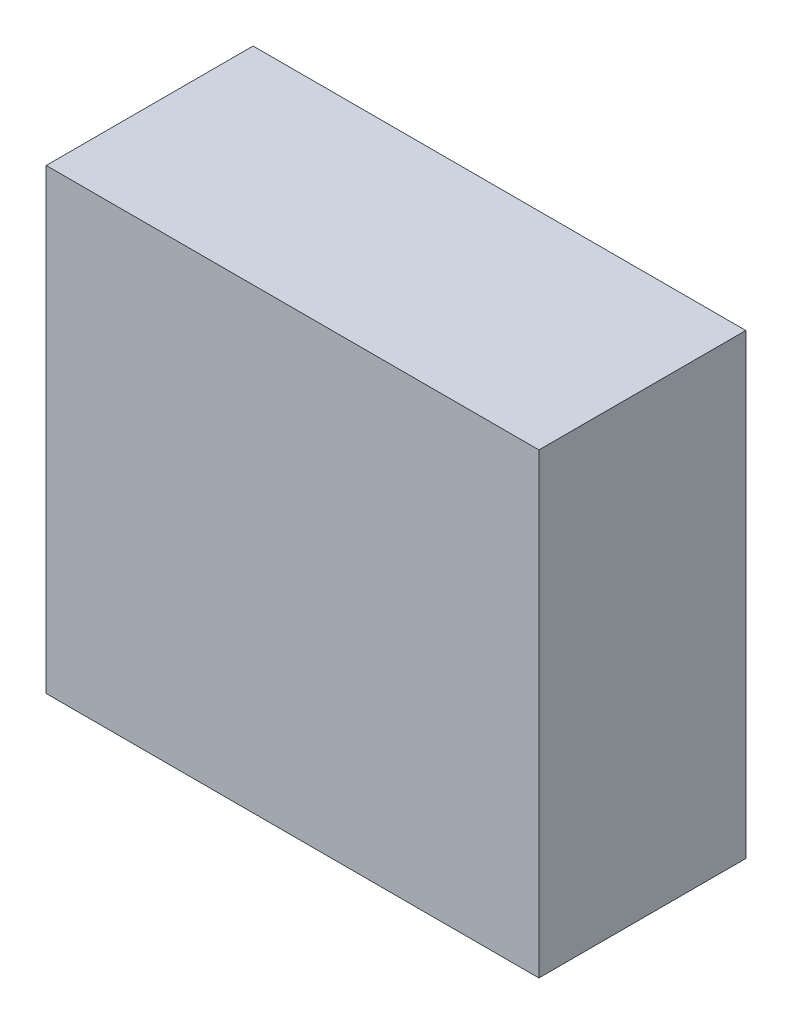
ISO-10303-21;
HEADER;
FILE_DESCRIPTION(('STEP AP214'),'2;1');
FILE_NAME('part.step','',(''),(''),'','','');
FILE_SCHEMA(('AUTOMOTIVE_DESIGN { 1 0 10303 214 1 1 1 1 }'));
ENDSEC;
DATA;
#1=APPLICATION_CONTEXT('core data for automotive mechanical design processes');
#2=APPLICATION_PROTOCOL_DEFINITION('international standard','automotive_design',2000,#1);
#3=PRODUCT_CONTEXT('',#1,'mechanical');
#4=PRODUCT('Part','Part','',(#3));
#5=PRODUCT_RELATED_PRODUCT_CATEGORY('part','',(#4));
#6=PRODUCT_DEFINITION_FORMATION('','',#4);
#7=PRODUCT_DEFINITION_CONTEXT('part definition',#1,'design');
#8=PRODUCT_DEFINITION('design','',#6,#7);
#9=PRODUCT_DEFINITION_SHAPE('','',#8);
#10=(LENGTH_UNIT() NAMED_UNIT(*) SI_UNIT(.MILLI.,.METRE.));
#11=(NAMED_UNIT(*) PLANE_ANGLE_UNIT() SI_UNIT($,.RADIAN.));
#12=(NAMED_UNIT(*) SI_UNIT($,.STERADIAN.) SOLID_ANGLE_UNIT());
#13=UNCERTAINTY_MEASURE_WITH_UNIT(LENGTH_MEASURE(1.E-05),#10,'distance_accuracy_value','');
#14=(GEOMETRIC_REPRESENTATION_CONTEXT(3) GLOBAL_UNCERTAINTY_ASSIGNED_CONTEXT((#13)) GLOBAL_UNIT_ASSIGNED_CONTEXT((#10,
#11,#12)) REPRESENTATION_CONTEXT('',''));
#15=CARTESIAN_POINT('',(0.,0.,0.));
#16=DIRECTION('',(0.,0.,1.));
#17=DIRECTION('',(1.,0.,0.));
#18=AXIS2_PLACEMENT_3D('',#15,#16,#17);
#19=CARTESIAN_POINT('',(-90.5,168.,38.));
#20=DIRECTION('',(1.,0.,0.));
#21=DIRECTION('',(0.,0.,-1.));
#22=AXIS2_PLACEMENT_3D('',#19,#20,#21);
#23=PLANE('',#22);
#24=DIRECTION('',(0.,0.,1.));
#25=VECTOR('',#24,1.);
#26=CARTESIAN_POINT('',(-90.5,0.,38.));
#27=LINE('',#26,#25);
#28=CARTESIAN_POINT('',(-90.5,0.,-38.));
#29=VERTEX_POINT('',#28);
#30=CARTESIAN_POINT('',(-90.5,0.,38.));
#31=VERTEX_POINT('',#30);
#32=EDGE_CURVE('E97',#29,#31,#27,.T.);
#33=ORIENTED_EDGE('',*,*,#32,.T.);
#34=DIRECTION('',(0.,-1.,0.));
#35=VECTOR('',#34,1.);
#36=CARTESIAN_POINT('',(-90.5,168.,38.));
#37=LINE('',#36,#35);
#38=CARTESIAN_POINT('',(-90.5,168.,38.));
#39=VERTEX_POINT('',#38);
#40=EDGE_CURVE('E11',#39,#31,#37,.T.);
#41=ORIENTED_EDGE('',*,*,#40,.F.);
#42=DIRECTION('',(0.,0.,1.));
#43=VECTOR('',#42,1.);
#44=CARTESIAN_POINT('',(-90.5,168.,38.));
#45=LINE('',#44,#43);
#46=CARTESIAN_POINT('',(-90.5,168.,-38.));
#47=VERTEX_POINT('',#46);
#48=EDGE_CURVE('E85',#47,#39,#45,.T.);
#49=ORIENTED_EDGE('',*,*,#48,.F.);
#50=DIRECTION('',(0.,-1.,0.));
#51=VECTOR('',#50,1.);
#52=CARTESIAN_POINT('',(-90.5,168.,-38.));
#53=LINE('',#52,#51);
#54=EDGE_CURVE('E93',#47,#29,#53,.T.);
#55=ORIENTED_EDGE('',*,*,#54,.T.);
#56=EDGE_LOOP('',(#33,#41,#49,#55));
#57=FACE_BOUND('',#56,.T.);
#58=ADVANCED_FACE('F34',(#57),#23,.F.);
#59=CARTESIAN_POINT('',(90.5,168.,38.));
#60=DIRECTION('',(0.,0.,-1.));
#61=DIRECTION('',(-1.,0.,0.));
#62=AXIS2_PLACEMENT_3D('',#59,#60,#61);
#63=PLANE('',#62);
#64=DIRECTION('',(1.,0.,0.));
#65=VECTOR('',#64,1.);
#66=CARTESIAN_POINT('',(90.5,0.,38.));
#67=LINE('',#66,#65);
#68=CARTESIAN_POINT('',(90.5,0.,38.));
#69=VERTEX_POINT('',#68);
#70=EDGE_CURVE('E89',#31,#69,#67,.T.);
#71=ORIENTED_EDGE('',*,*,#70,.T.);
#72=DIRECTION('',(0.,-1.,0.));
#73=VECTOR('',#72,1.);
#74=CARTESIAN_POINT('',(90.5,168.,38.));
#75=LINE('',#74,#73);
#76=CARTESIAN_POINT('',(90.5,168.,38.));
#77=VERTEX_POINT('',#76);
#78=EDGE_CURVE('E42',#77,#69,#75,.T.);
#79=ORIENTED_EDGE('',*,*,#78,.F.);
#80=DIRECTION('',(1.,0.,0.));
#81=VECTOR('',#80,1.);
#82=CARTESIAN_POINT('',(90.5,168.,38.));
#83=LINE('',#82,#81);
#84=EDGE_CURVE('E80',#39,#77,#83,.T.);
#85=ORIENTED_EDGE('',*,*,#84,.F.);
#86=ORIENTED_EDGE('',*,*,#40,.T.);
#87=EDGE_LOOP('',(#71,#79,#85,#86));
#88=FACE_BOUND('',#87,.T.);
#89=ADVANCED_FACE('F88',(#88),#63,.F.);
#90=CARTESIAN_POINT('',(90.5,168.,38.));
#91=DIRECTION('',(-1.,0.,0.));
#92=DIRECTION('',(0.,0.,1.));
#93=AXIS2_PLACEMENT_3D('',#90,#91,#92);
#94=PLANE('',#93);
#95=DIRECTION('',(0.,0.,-1.));
#96=VECTOR('',#95,1.);
#97=CARTESIAN_POINT('',(90.5,0.,38.));
#98=LINE('',#97,#96);
#99=CARTESIAN_POINT('',(90.5,0.,-38.));
#100=VERTEX_POINT('',#99);
#101=EDGE_CURVE('E67',#69,#100,#98,.T.);
#102=ORIENTED_EDGE('',*,*,#101,.T.);
#103=DIRECTION('',(0.,-1.,0.));
#104=VECTOR('',#103,1.);
#105=CARTESIAN_POINT('',(90.5,168.,-38.));
#106=LINE('',#105,#104);
#107=CARTESIAN_POINT('',(90.5,168.,-38.));
#108=VERTEX_POINT('',#107);
#109=EDGE_CURVE('E90',#108,#100,#106,.T.);
#110=ORIENTED_EDGE('',*,*,#109,.F.);
#111=DIRECTION('',(0.,0.,-1.));
#112=VECTOR('',#111,1.);
#113=CARTESIAN_POINT('',(90.5,168.,38.));
#114=LINE('',#113,#112);
#115=EDGE_CURVE('E83',#77,#108,#114,.T.);
#116=ORIENTED_EDGE('',*,*,#115,.F.);
#117=ORIENTED_EDGE('',*,*,#78,.T.);
#118=EDGE_LOOP('',(#102,#110,#116,#117));
#119=FACE_BOUND('',#118,.T.);
#120=ADVANCED_FACE('F91',(#119),#94,.F.);
#121=CARTESIAN_POINT('',(90.5,168.,-38.));
#122=DIRECTION('',(0.,0.,1.));
#123=DIRECTION('',(1.,0.,0.));
#124=AXIS2_PLACEMENT_3D('',#121,#122,#123);
#125=PLANE('',#124);
#126=DIRECTION('',(-1.,0.,0.));
#127=VECTOR('',#126,1.);
#128=CARTESIAN_POINT('',(90.5,0.,-38.));
#129=LINE('',#128,#127);
#130=EDGE_CURVE('E73',#100,#29,#129,.T.);
#131=ORIENTED_EDGE('',*,*,#130,.T.);
#132=ORIENTED_EDGE('',*,*,#54,.F.);
#133=DIRECTION('',(-1.,0.,0.));
#134=VECTOR('',#133,1.);
#135=CARTESIAN_POINT('',(90.5,168.,-38.));
#136=LINE('',#135,#134);
#137=EDGE_CURVE('E50',#108,#47,#136,.T.);
#138=ORIENTED_EDGE('',*,*,#137,.F.);
#139=ORIENTED_EDGE('',*,*,#109,.T.);
#140=EDGE_LOOP('',(#131,#132,#138,#139));
#141=FACE_BOUND('',#140,.T.);
#142=ADVANCED_FACE('F104',(#141),#125,.F.);
#143=CARTESIAN_POINT('',(0.,168.,0.));
#144=DIRECTION('',(0.,1.,0.));
#145=DIRECTION('',(0.,0.,1.));
#146=AXIS2_PLACEMENT_3D('',#143,#144,#145);
#147=PLANE('',#146);
#148=ORIENTED_EDGE('',*,*,#48,.T.);
#149=ORIENTED_EDGE('',*,*,#84,.T.);
#150=ORIENTED_EDGE('',*,*,#115,.T.);
#151=ORIENTED_EDGE('',*,*,#137,.T.);
#152=EDGE_LOOP('',(#148,#149,#150,#151));
#153=FACE_BOUND('',#152,.T.);
#154=ADVANCED_FACE('F81',(#153),#147,.T.);
#155=CARTESIAN_POINT('',(0.,0.,0.));
#156=DIRECTION('',(0.,1.,0.));
#157=DIRECTION('',(0.,0.,1.));
#158=AXIS2_PLACEMENT_3D('',#155,#156,#157);
#159=PLANE('',#158);
#160=ORIENTED_EDGE('',*,*,#32,.F.);
#161=ORIENTED_EDGE('',*,*,#130,.F.);
#162=ORIENTED_EDGE('',*,*,#101,.F.);
#163=ORIENTED_EDGE('',*,*,#70,.F.);
#164=EDGE_LOOP('',(#160,#161,#162,#163));
#165=FACE_BOUND('',#164,.T.);
#166=ADVANCED_FACE('F107',(#165),#159,.F.);
#167=CLOSED_SHELL('',(#58,#89,#120,#142,#154,#166));
#168=MANIFOLD_SOLID_BREP('B2',#167);
#169=ADVANCED_BREP_SHAPE_REPRESENTATION('',(#18,#168),#14);
#170=SHAPE_DEFINITION_REPRESENTATION(#9,#169);
ENDSEC;
END-ISO-10303-21;
